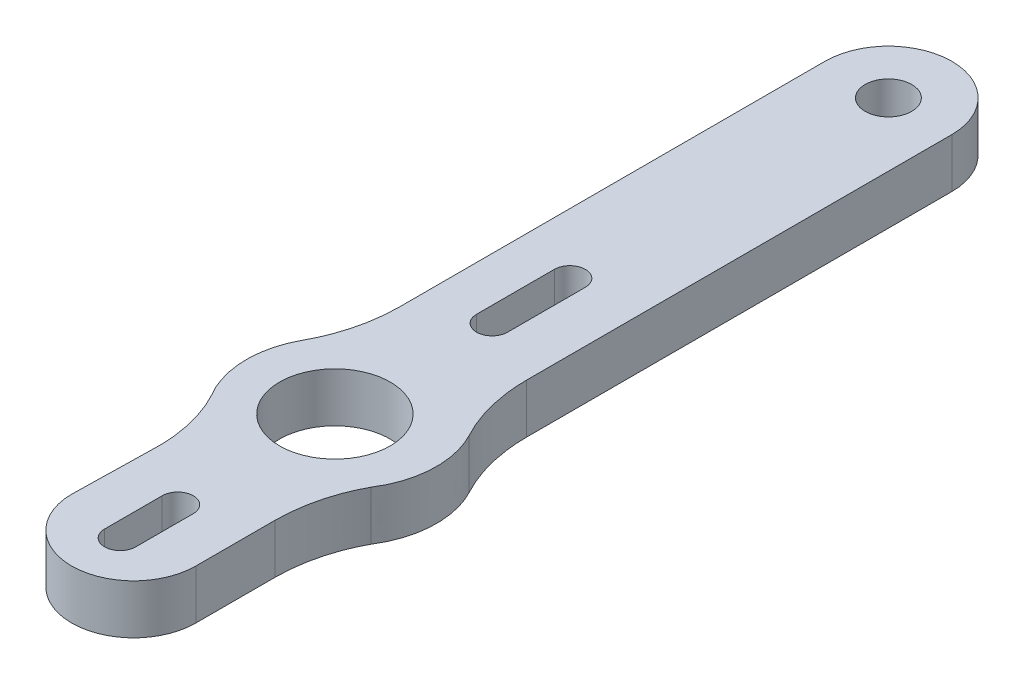
ISO-10303-21;
HEADER;
FILE_DESCRIPTION(('STEP AP214'),'2;1');
FILE_NAME('part.step','',(''),(''),'','','');
FILE_SCHEMA(('AUTOMOTIVE_DESIGN { 1 0 10303 214 1 1 1 1 }'));
ENDSEC;
DATA;
#1=APPLICATION_CONTEXT('core data for automotive mechanical design processes');
#2=APPLICATION_PROTOCOL_DEFINITION('international standard','automotive_design',2000,#1);
#3=PRODUCT_CONTEXT('',#1,'mechanical');
#4=PRODUCT('Part','Part','',(#3));
#5=PRODUCT_RELATED_PRODUCT_CATEGORY('part','',(#4));
#6=PRODUCT_DEFINITION_FORMATION('','',#4);
#7=PRODUCT_DEFINITION_CONTEXT('part definition',#1,'design');
#8=PRODUCT_DEFINITION('design','',#6,#7);
#9=PRODUCT_DEFINITION_SHAPE('','',#8);
#10=(LENGTH_UNIT() NAMED_UNIT(*) SI_UNIT(.MILLI.,.METRE.));
#11=(NAMED_UNIT(*) PLANE_ANGLE_UNIT() SI_UNIT($,.RADIAN.));
#12=(NAMED_UNIT(*) SI_UNIT($,.STERADIAN.) SOLID_ANGLE_UNIT());
#13=UNCERTAINTY_MEASURE_WITH_UNIT(LENGTH_MEASURE(1.E-05),#10,'distance_accuracy_value','');
#14=(GEOMETRIC_REPRESENTATION_CONTEXT(3) GLOBAL_UNCERTAINTY_ASSIGNED_CONTEXT((#13)) GLOBAL_UNIT_ASSIGNED_CONTEXT((#10,
#11,#12)) REPRESENTATION_CONTEXT('',''));
#15=CARTESIAN_POINT('',(0.,0.,0.));
#16=DIRECTION('',(0.,0.,1.));
#17=DIRECTION('',(1.,0.,0.));
#18=AXIS2_PLACEMENT_3D('',#15,#16,#17);
#19=CARTESIAN_POINT('',(-4.16908106055203,3.175,15.9949920017812));
#20=DIRECTION('',(0.,-1.,0.));
#21=DIRECTION('',(0.,0.,-1.));
#22=AXIS2_PLACEMENT_3D('',#19,#20,#21);
#23=PLANE('',#22);
#24=CARTESIAN_POINT('',(0.00104066737557961,3.175,10.9132962446336));
#25=DIRECTION('',(0.,1.,0.));
#26=DIRECTION('',(0.,0.,1.));
#27=AXIS2_PLACEMENT_3D('',#24,#25,#26);
#28=CIRCLE('',#27,3.556);
#29=CARTESIAN_POINT('',(0.00104066737557961,3.175,14.4692962446336));
#30=VERTEX_POINT('',#29);
#31=EDGE_CURVE('E206',#30,#30,#28,.T.);
#32=ORIENTED_EDGE('',*,*,#31,.F.);
#33=EDGE_LOOP('',(#32));
#34=FACE_BOUND('',#33,.T.);
#35=CARTESIAN_POINT('',(0.00106991381050581,3.175,0.813017652380107));
#36=DIRECTION('',(0.,1.,0.));
#37=DIRECTION('',(0.,0.,-1.));
#38=AXIS2_PLACEMENT_3D('',#35,#36,#37);
#39=CIRCLE('',#38,0.998231383477141);
#40=CARTESIAN_POINT('',(-0.997161469666635,3.175,0.813017652380107));
#41=VERTEX_POINT('',#40);
#42=CARTESIAN_POINT('',(0.999301297287647,3.175,0.813017652380107));
#43=VERTEX_POINT('',#42);
#44=EDGE_CURVE('E212',#41,#43,#39,.T.);
#45=ORIENTED_EDGE('',*,*,#44,.F.);
#46=DIRECTION('',(0.,0.,1.));
#47=VECTOR('',#46,1.);
#48=CARTESIAN_POINT('',(-0.997161469666635,3.175,-4.18720119916506));
#49=LINE('',#48,#47);
#50=CARTESIAN_POINT('',(-0.997161469666635,3.175,-4.18720119916506));
#51=VERTEX_POINT('',#50);
#52=EDGE_CURVE('E220',#51,#41,#49,.T.);
#53=ORIENTED_EDGE('',*,*,#52,.F.);
#54=CARTESIAN_POINT('',(0.00106991381050581,3.175,-4.18720119916506));
#55=DIRECTION('',(0.,1.,0.));
#56=DIRECTION('',(0.,0.,-1.));
#57=AXIS2_PLACEMENT_3D('',#54,#55,#56);
#58=CIRCLE('',#57,0.998231383477141);
#59=CARTESIAN_POINT('',(0.999301297287647,3.175,-4.18720119916506));
#60=VERTEX_POINT('',#59);
#61=EDGE_CURVE('E217',#60,#51,#58,.T.);
#62=ORIENTED_EDGE('',*,*,#61,.F.);
#63=DIRECTION('',(0.,0.,-1.));
#64=VECTOR('',#63,1.);
#65=CARTESIAN_POINT('',(0.999301297287647,3.175,0.813017652380107));
#66=LINE('',#65,#64);
#67=EDGE_CURVE('E214',#43,#60,#66,.T.);
#68=ORIENTED_EDGE('',*,*,#67,.F.);
#69=EDGE_LOOP('',(#45,#53,#62,#68));
#70=FACE_BOUND('',#69,.T.);
#71=CARTESIAN_POINT('',(-5.01632488886748,3.175,13.8183221379926));
#72=CARTESIAN_POINT('',(-4.27138671891038,3.175,15.1671684650016));
#73=CARTESIAN_POINT('',(-3.8805408597044,3.175,16.7746802356492));
#74=CARTESIAN_POINT('',(-3.8805408597044,3.175,18.3160677743046));
#75=B_SPLINE_CURVE_WITH_KNOTS('',3,(#71,#72,#73,#74),.UNSPECIFIED.,.F.,.F.,(4,4),(17.,18.),.UNSPECIFIED.);
#76=CARTESIAN_POINT('',(-5.01632488886748,3.175,13.8183221379926));
#77=VERTEX_POINT('',#76);
#78=CARTESIAN_POINT('',(-3.8805408597044,3.175,18.3160677743046));
#79=VERTEX_POINT('',#78);
#80=EDGE_CURVE('E248',#77,#79,#75,.T.);
#81=ORIENTED_EDGE('',*,*,#80,.T.);
#82=DIRECTION('',(-0.0201380543596992,0.,0.999797208821172));
#83=VECTOR('',#82,1.);
#84=CARTESIAN_POINT('',(-3.9918751177016,3.175,23.8434975052788));
#85=LINE('',#84,#83);
#86=CARTESIAN_POINT('',(-3.9918751177016,3.175,23.8434975052788));
#87=VERTEX_POINT('',#86);
#88=EDGE_CURVE('E254',#79,#87,#85,.T.);
#89=ORIENTED_EDGE('',*,*,#88,.T.);
#90=CARTESIAN_POINT('',(0.00106991313382748,3.175,23.8434975052788));
#91=DIRECTION('',(0.,1.,0.));
#92=DIRECTION('',(0.,0.,-1.));
#93=AXIS2_PLACEMENT_3D('',#90,#91,#92);
#94=CIRCLE('',#93,3.99294503083543);
#95=CARTESIAN_POINT('',(3.99401494396925,3.175,23.8434975052788));
#96=VERTEX_POINT('',#95);
#97=EDGE_CURVE('E260',#87,#96,#94,.T.);
#98=ORIENTED_EDGE('',*,*,#97,.T.);
#99=DIRECTION('',(0.,0.,-1.));
#100=VECTOR('',#99,1.);
#101=CARTESIAN_POINT('',(3.99401494396925,3.175,18.7597185620705));
#102=LINE('',#101,#100);
#103=CARTESIAN_POINT('',(3.99401494396925,3.175,18.7597185620705));
#104=VERTEX_POINT('',#103);
#105=EDGE_CURVE('E262',#96,#104,#102,.T.);
#106=ORIENTED_EDGE('',*,*,#105,.T.);
#107=CARTESIAN_POINT('',(3.99401494396925,3.175,18.7597185620705));
#108=CARTESIAN_POINT('',(3.99401494404401,3.175,17.0662909012822));
#109=CARTESIAN_POINT('',(4.42341324434701,3.175,15.3002166148642));
#110=CARTESIAN_POINT('',(5.24176274182083,3.175,13.8183221379926));
#111=B_SPLINE_CURVE_WITH_KNOTS('',3,(#107,#108,#109,#110),.UNSPECIFIED.,.F.,.F.,(4,4),(11.,12.),.UNSPECIFIED.);
#112=CARTESIAN_POINT('',(5.24176274182083,3.175,13.8183221379926));
#113=VERTEX_POINT('',#112);
#114=EDGE_CURVE('E264',#104,#113,#111,.T.);
#115=ORIENTED_EDGE('',*,*,#114,.T.);
#116=CARTESIAN_POINT('',(5.24176274182083,3.175,13.8183221379926));
#117=CARTESIAN_POINT('',(6.37392492293468,3.175,12.0533043274419));
#118=CARTESIAN_POINT('',(6.5298845256268,3.175,9.76643510192553));
#119=CARTESIAN_POINT('',(5.52292472318315,3.175,7.81618794224595));
#120=B_SPLINE_CURVE_WITH_KNOTS('',3,(#116,#117,#118,#119),.UNSPECIFIED.,.F.,.F.,(4,4),(9.,10.),.UNSPECIFIED.);
#121=CARTESIAN_POINT('',(5.52292472318315,3.175,7.81618794224595));
#122=VERTEX_POINT('',#121);
#123=EDGE_CURVE('E269',#113,#122,#120,.T.);
#124=ORIENTED_EDGE('',*,*,#123,.T.);
#125=CARTESIAN_POINT('',(5.52292472318315,3.175,7.81618794224595));
#126=CARTESIAN_POINT('',(4.70457522584158,3.175,6.33422998434839));
#127=CARTESIAN_POINT('',(4.27517692569758,3.175,4.56821917884142));
#128=CARTESIAN_POINT('',(4.27517692577307,3.175,2.8747280371003));
#129=B_SPLINE_CURVE_WITH_KNOTS('',3,(#125,#126,#127,#128),.UNSPECIFIED.,.F.,.F.,(4,4),(8.,9.),.UNSPECIFIED.);
#130=CARTESIAN_POINT('',(4.27517692577307,3.175,2.8747280371003));
#131=VERTEX_POINT('',#130);
#132=EDGE_CURVE('E468',#122,#131,#129,.T.);
#133=ORIENTED_EDGE('',*,*,#132,.T.);
#134=DIRECTION('',(0.,0.,-1.));
#135=VECTOR('',#134,1.);
#136=CARTESIAN_POINT('',(4.27517692577307,3.175,-24.4794195778738));
#137=LINE('',#136,#135);
#138=CARTESIAN_POINT('',(4.27517692577307,3.175,-24.4794195778738));
#139=VERTEX_POINT('',#138);
#140=EDGE_CURVE('E463',#131,#139,#137,.T.);
#141=ORIENTED_EDGE('',*,*,#140,.T.);
#142=CARTESIAN_POINT('',(0.197318033034327,3.175,-24.4630373756859));
#143=DIRECTION('',(0.,1.,0.));
#144=DIRECTION('',(0.,0.,1.));
#145=AXIS2_PLACEMENT_3D('',#142,#143,#144);
#146=CIRCLE('',#145,4.07789179915761);
#147=CARTESIAN_POINT('',(-3.88054085970441,3.175,-24.4466551734979));
#148=VERTEX_POINT('',#147);
#149=EDGE_CURVE('E459',#139,#148,#146,.T.);
#150=ORIENTED_EDGE('',*,*,#149,.T.);
#151=DIRECTION('',(0.,0.,1.));
#152=VECTOR('',#151,1.);
#153=CARTESIAN_POINT('',(-3.88054085970441,3.175,-24.4466551734979));
#154=LINE('',#153,#152);
#155=CARTESIAN_POINT('',(-3.88054085970441,3.175,2.87423818270168));
#156=VERTEX_POINT('',#155);
#157=EDGE_CURVE('E450',#148,#156,#154,.T.);
#158=ORIENTED_EDGE('',*,*,#157,.T.);
#159=CARTESIAN_POINT('',(-3.88054085970441,3.175,2.87423818270168));
#160=CARTESIAN_POINT('',(-3.87987552925061,3.175,4.56772919374628));
#161=CARTESIAN_POINT('',(-4.30857997471308,3.175,6.33390856282873));
#162=CARTESIAN_POINT('',(-5.12641542509204,3.175,7.81618794224595));
#163=B_SPLINE_CURVE_WITH_KNOTS('',3,(#159,#160,#161,#162),.UNSPECIFIED.,.F.,.F.,(4,4),(2.,3.),.UNSPECIFIED.);
#164=CARTESIAN_POINT('',(-5.12641542509204,3.175,7.81618794224595));
#165=VERTEX_POINT('',#164);
#166=EDGE_CURVE('E328',#156,#165,#163,.T.);
#167=ORIENTED_EDGE('',*,*,#166,.T.);
#168=CARTESIAN_POINT('',(-5.12641542509204,3.175,7.81618794224595));
#169=CARTESIAN_POINT('',(-6.18649366447637,3.175,9.73551085026569));
#170=CARTESIAN_POINT('',(-6.09564359098047,3.175,12.0230732710247));
#171=CARTESIAN_POINT('',(-5.01632488886748,3.175,13.8183221379926));
#172=B_SPLINE_CURVE_WITH_KNOTS('',3,(#168,#169,#170,#171),.UNSPECIFIED.,.F.,.F.,(4,4),
(1.00565880697643,2.),.UNSPECIFIED.);
#173=EDGE_CURVE('E322',#165,#77,#172,.T.);
#174=ORIENTED_EDGE('',*,*,#173,.T.);
#175=EDGE_LOOP('',(#81,#89,#98,#106,#115,#124,#133,#141,#150,#158,#167,#174));
#176=FACE_BOUND('',#175,.T.);
#177=CARTESIAN_POINT('',(0.197318033034327,3.175,-24.4630373756859));
#178=DIRECTION('',(0.,1.,0.));
#179=DIRECTION('',(0.,0.,1.));
#180=AXIS2_PLACEMENT_3D('',#177,#178,#179);
#181=CIRCLE('',#180,1.4986);
#182=CARTESIAN_POINT('',(0.197318033034327,3.175,-22.9644373756859));
#183=VERTEX_POINT('',#182);
#184=EDGE_CURVE('E243',#183,#183,#181,.T.);
#185=ORIENTED_EDGE('',*,*,#184,.F.);
#186=EDGE_LOOP('',(#185));
#187=FACE_BOUND('',#186,.T.);
#188=CARTESIAN_POINT('',(0.00106991253301218,3.175,24.7136744780451));
#189=DIRECTION('',(0.,1.,0.));
#190=DIRECTION('',(0.,0.,1.));
#191=AXIS2_PLACEMENT_3D('',#188,#189,#190);
#192=CIRCLE('',#191,0.998231383459032);
#193=CARTESIAN_POINT('',(-0.99716147092602,3.175,24.7136744780451));
#194=VERTEX_POINT('',#193);
#195=CARTESIAN_POINT('',(0.999301295992044,3.175,24.7136744780451));
#196=VERTEX_POINT('',#195);
#197=EDGE_CURVE('E170',#194,#196,#192,.T.);
#198=ORIENTED_EDGE('',*,*,#197,.F.);
#199=DIRECTION('',(0.,0.,1.));
#200=VECTOR('',#199,1.);
#201=CARTESIAN_POINT('',(-0.99716147092602,3.175,24.7136744780451));
#202=LINE('',#201,#200);
#203=CARTESIAN_POINT('',(-0.99716147092602,3.175,21.013579720048));
#204=VERTEX_POINT('',#203);
#205=EDGE_CURVE('E192',#204,#194,#202,.T.);
#206=ORIENTED_EDGE('',*,*,#205,.F.);
#207=CARTESIAN_POINT('',(0.00106991253301207,3.175,21.013579720048));
#208=DIRECTION('',(0.,1.,0.));
#209=DIRECTION('',(0.,0.,-1.));
#210=AXIS2_PLACEMENT_3D('',#207,#208,#209);
#211=CIRCLE('',#210,0.998231383459032);
#212=CARTESIAN_POINT('',(0.999301295992044,3.175,21.013579720048));
#213=VERTEX_POINT('',#212);
#214=EDGE_CURVE('E190',#213,#204,#211,.T.);
#215=ORIENTED_EDGE('',*,*,#214,.F.);
#216=DIRECTION('',(0.,0.,-1.));
#217=VECTOR('',#216,1.);
#218=CARTESIAN_POINT('',(0.999301295992044,3.175,24.7136744780451));
#219=LINE('',#218,#217);
#220=EDGE_CURVE('E178',#196,#213,#219,.T.);
#221=ORIENTED_EDGE('',*,*,#220,.F.);
#222=EDGE_LOOP('',(#198,#206,#215,#221));
#223=FACE_BOUND('',#222,.T.);
#224=ADVANCED_FACE('F32',(#34,#70,#176,#187,#223),#23,.F.);
#225=CARTESIAN_POINT('',(-4.16908106055203,0.,15.9949920017812));
#226=DIRECTION('',(0.,-1.,0.));
#227=DIRECTION('',(0.,0.,-1.));
#228=AXIS2_PLACEMENT_3D('',#225,#226,#227);
#229=PLANE('',#228);
#230=DIRECTION('',(0.,0.,1.));
#231=VECTOR('',#230,1.);
#232=CARTESIAN_POINT('',(-0.997161469666635,0.,-4.18720119916506));
#233=LINE('',#232,#231);
#234=CARTESIAN_POINT('',(-0.997161469666635,0.,-4.18720119916506));
#235=VERTEX_POINT('',#234);
#236=CARTESIAN_POINT('',(-0.997161469666635,0.,0.813017652380107));
#237=VERTEX_POINT('',#236);
#238=EDGE_CURVE('E215',#235,#237,#233,.T.);
#239=ORIENTED_EDGE('',*,*,#238,.T.);
#240=CARTESIAN_POINT('',(0.00106991381050581,0.,0.813017652380107));
#241=DIRECTION('',(0.,1.,0.));
#242=DIRECTION('',(0.,0.,-1.));
#243=AXIS2_PLACEMENT_3D('',#240,#241,#242);
#244=CIRCLE('',#243,0.998231383477141);
#245=CARTESIAN_POINT('',(0.999301297287647,0.,0.813017652380107));
#246=VERTEX_POINT('',#245);
#247=EDGE_CURVE('E209',#237,#246,#244,.T.);
#248=ORIENTED_EDGE('',*,*,#247,.T.);
#249=DIRECTION('',(0.,0.,-1.));
#250=VECTOR('',#249,1.);
#251=CARTESIAN_POINT('',(0.999301297287647,0.,0.813017652380107));
#252=LINE('',#251,#250);
#253=CARTESIAN_POINT('',(0.999301297287647,0.,-4.18720119916506));
#254=VERTEX_POINT('',#253);
#255=EDGE_CURVE('E225',#246,#254,#252,.T.);
#256=ORIENTED_EDGE('',*,*,#255,.T.);
#257=CARTESIAN_POINT('',(0.00106991381050581,0.,-4.18720119916506));
#258=DIRECTION('',(0.,1.,0.));
#259=DIRECTION('',(0.,0.,-1.));
#260=AXIS2_PLACEMENT_3D('',#257,#258,#259);
#261=CIRCLE('',#260,0.998231383477141);
#262=EDGE_CURVE('E228',#254,#235,#261,.T.);
#263=ORIENTED_EDGE('',*,*,#262,.T.);
#264=EDGE_LOOP('',(#239,#248,#256,#263));
#265=FACE_BOUND('',#264,.T.);
#266=CARTESIAN_POINT('',(0.197318033034327,0.,-24.4630373756859));
#267=DIRECTION('',(0.,1.,0.));
#268=DIRECTION('',(0.,0.,1.));
#269=AXIS2_PLACEMENT_3D('',#266,#267,#268);
#270=CIRCLE('',#269,1.4986);
#271=CARTESIAN_POINT('',(0.197318033034327,0.,-22.9644373756859));
#272=VERTEX_POINT('',#271);
#273=EDGE_CURVE('E242',#272,#272,#270,.T.);
#274=ORIENTED_EDGE('',*,*,#273,.T.);
#275=EDGE_LOOP('',(#274));
#276=FACE_BOUND('',#275,.T.);
#277=CARTESIAN_POINT('',(-5.01632488886748,0.,13.8183221379926));
#278=CARTESIAN_POINT('',(-4.27138671891038,0.,15.1671684650016));
#279=CARTESIAN_POINT('',(-3.8805408597044,0.,16.7746802356492));
#280=CARTESIAN_POINT('',(-3.8805408597044,0.,18.3160677743046));
#281=B_SPLINE_CURVE_WITH_KNOTS('',3,(#277,#278,#279,#280),.UNSPECIFIED.,.F.,.F.,(4,4),(17.,18.),.UNSPECIFIED.);
#282=CARTESIAN_POINT('',(-5.01632488886748,0.,13.8183221379926));
#283=VERTEX_POINT('',#282);
#284=CARTESIAN_POINT('',(-3.8805408597044,0.,18.3160677743046));
#285=VERTEX_POINT('',#284);
#286=EDGE_CURVE('E246',#283,#285,#281,.T.);
#287=ORIENTED_EDGE('',*,*,#286,.F.);
#288=CARTESIAN_POINT('',(-5.12641542509204,0.,7.81618794224595));
#289=CARTESIAN_POINT('',(-6.18649366447637,0.,9.73551085026569));
#290=CARTESIAN_POINT('',(-6.09564359098047,0.,12.0230732710247));
#291=CARTESIAN_POINT('',(-5.01632488886748,0.,13.8183221379926));
#292=B_SPLINE_CURVE_WITH_KNOTS('',3,(#288,#289,#290,#291),.UNSPECIFIED.,.F.,.F.,(4,4),
(1.00565880697643,2.),.UNSPECIFIED.);
#293=CARTESIAN_POINT('',(-5.12641542509204,0.,7.81618794224595));
#294=VERTEX_POINT('',#293);
#295=EDGE_CURVE('E255',#294,#283,#292,.T.);
#296=ORIENTED_EDGE('',*,*,#295,.F.);
#297=CARTESIAN_POINT('',(-3.88054085970441,0.,2.87423818270168));
#298=CARTESIAN_POINT('',(-3.87987552925061,0.,4.56772919374628));
#299=CARTESIAN_POINT('',(-4.30857997471308,0.,6.33390856282873));
#300=CARTESIAN_POINT('',(-5.12641542509204,0.,7.81618794224595));
#301=B_SPLINE_CURVE_WITH_KNOTS('',3,(#297,#298,#299,#300),.UNSPECIFIED.,.F.,.F.,(4,4),(2.,3.),.UNSPECIFIED.);
#302=CARTESIAN_POINT('',(-3.88054085970441,0.,2.87423818270168));
#303=VERTEX_POINT('',#302);
#304=EDGE_CURVE('E376',#303,#294,#301,.T.);
#305=ORIENTED_EDGE('',*,*,#304,.F.);
#306=DIRECTION('',(0.,0.,1.));
#307=VECTOR('',#306,1.);
#308=CARTESIAN_POINT('',(-3.88054085970441,0.,-24.4466551734979));
#309=LINE('',#308,#307);
#310=CARTESIAN_POINT('',(-3.88054085970441,0.,-24.4466551734979));
#311=VERTEX_POINT('',#310);
#312=EDGE_CURVE('E374',#311,#303,#309,.T.);
#313=ORIENTED_EDGE('',*,*,#312,.F.);
#314=CARTESIAN_POINT('',(0.197318033034327,0.,-24.4630373756859));
#315=DIRECTION('',(0.,1.,0.));
#316=DIRECTION('',(0.,0.,1.));
#317=AXIS2_PLACEMENT_3D('',#314,#315,#316);
#318=CIRCLE('',#317,4.07789179915761);
#319=CARTESIAN_POINT('',(4.27517692577307,0.,-24.4794195778738));
#320=VERTEX_POINT('',#319);
#321=EDGE_CURVE('E372',#320,#311,#318,.T.);
#322=ORIENTED_EDGE('',*,*,#321,.F.);
#323=DIRECTION('',(0.,0.,-1.));
#324=VECTOR('',#323,1.);
#325=CARTESIAN_POINT('',(4.27517692577307,0.,-24.4794195778738));
#326=LINE('',#325,#324);
#327=CARTESIAN_POINT('',(4.27517692577307,0.,2.8747280371003));
#328=VERTEX_POINT('',#327);
#329=EDGE_CURVE('E367',#328,#320,#326,.T.);
#330=ORIENTED_EDGE('',*,*,#329,.F.);
#331=CARTESIAN_POINT('',(5.52292472318315,0.,7.81618794224595));
#332=CARTESIAN_POINT('',(4.70457522584158,0.,6.33422998434839));
#333=CARTESIAN_POINT('',(4.27517692569758,0.,4.56821917884142));
#334=CARTESIAN_POINT('',(4.27517692577307,0.,2.8747280371003));
#335=B_SPLINE_CURVE_WITH_KNOTS('',3,(#331,#332,#333,#334),.UNSPECIFIED.,.F.,.F.,(4,4),(8.,9.),.UNSPECIFIED.);
#336=CARTESIAN_POINT('',(5.52292472318315,0.,7.81618794224595));
#337=VERTEX_POINT('',#336);
#338=EDGE_CURVE('E360',#337,#328,#335,.T.);
#339=ORIENTED_EDGE('',*,*,#338,.F.);
#340=CARTESIAN_POINT('',(5.24176274182083,0.,13.8183221379926));
#341=CARTESIAN_POINT('',(6.37392492293468,0.,12.0533043274419));
#342=CARTESIAN_POINT('',(6.5298845256268,0.,9.76643510192553));
#343=CARTESIAN_POINT('',(5.52292472318315,0.,7.81618794224595));
#344=B_SPLINE_CURVE_WITH_KNOTS('',3,(#340,#341,#342,#343),.UNSPECIFIED.,.F.,.F.,(4,4),(9.,10.),.UNSPECIFIED.);
#345=CARTESIAN_POINT('',(5.24176274182083,0.,13.8183221379926));
#346=VERTEX_POINT('',#345);
#347=EDGE_CURVE('E353',#346,#337,#344,.T.);
#348=ORIENTED_EDGE('',*,*,#347,.F.);
#349=CARTESIAN_POINT('',(3.99401494396925,0.,18.7597185620705));
#350=CARTESIAN_POINT('',(3.99401494404401,0.,17.0662909012822));
#351=CARTESIAN_POINT('',(4.42341324434701,0.,15.3002166148642));
#352=CARTESIAN_POINT('',(5.24176274182083,0.,13.8183221379926));
#353=B_SPLINE_CURVE_WITH_KNOTS('',3,(#349,#350,#351,#352),.UNSPECIFIED.,.F.,.F.,(4,4),(11.,12.),.UNSPECIFIED.);
#354=CARTESIAN_POINT('',(3.99401494396925,0.,18.7597185620705));
#355=VERTEX_POINT('',#354);
#356=EDGE_CURVE('E349',#355,#346,#353,.T.);
#357=ORIENTED_EDGE('',*,*,#356,.F.);
#358=DIRECTION('',(0.,0.,-1.));
#359=VECTOR('',#358,1.);
#360=CARTESIAN_POINT('',(3.99401494396925,0.,18.7597185620705));
#361=LINE('',#360,#359);
#362=CARTESIAN_POINT('',(3.99401494396925,0.,23.8434975052788));
#363=VERTEX_POINT('',#362);
#364=EDGE_CURVE('E347',#363,#355,#361,.T.);
#365=ORIENTED_EDGE('',*,*,#364,.F.);
#366=CARTESIAN_POINT('',(0.00106991313382748,0.,23.8434975052788));
#367=DIRECTION('',(0.,1.,0.));
#368=DIRECTION('',(0.,0.,-1.));
#369=AXIS2_PLACEMENT_3D('',#366,#367,#368);
#370=CIRCLE('',#369,3.99294503083543);
#371=CARTESIAN_POINT('',(-3.9918751177016,0.,23.8434975052788));
#372=VERTEX_POINT('',#371);
#373=EDGE_CURVE('E345',#372,#363,#370,.T.);
#374=ORIENTED_EDGE('',*,*,#373,.F.);
#375=DIRECTION('',(-0.0201380543596992,0.,0.999797208821172));
#376=VECTOR('',#375,1.);
#377=CARTESIAN_POINT('',(-3.9918751177016,0.,23.8434975052788));
#378=LINE('',#377,#376);
#379=EDGE_CURVE('E340',#285,#372,#378,.T.);
#380=ORIENTED_EDGE('',*,*,#379,.F.);
#381=EDGE_LOOP('',(#287,#296,#305,#313,#322,#330,#339,#348,#357,#365,#374,#380));
#382=FACE_BOUND('',#381,.T.);
#383=CARTESIAN_POINT('',(0.00104066737557961,0.,10.9132962446336));
#384=DIRECTION('',(0.,1.,0.));
#385=DIRECTION('',(0.,0.,1.));
#386=AXIS2_PLACEMENT_3D('',#383,#384,#385);
#387=CIRCLE('',#386,3.556);
#388=CARTESIAN_POINT('',(0.00104066737557961,0.,14.4692962446336));
#389=VERTEX_POINT('',#388);
#390=EDGE_CURVE('E186',#389,#389,#387,.T.);
#391=ORIENTED_EDGE('',*,*,#390,.T.);
#392=EDGE_LOOP('',(#391));
#393=FACE_BOUND('',#392,.T.);
#394=DIRECTION('',(0.,0.,1.));
#395=VECTOR('',#394,1.);
#396=CARTESIAN_POINT('',(-0.99716147092602,0.,24.7136744780451));
#397=LINE('',#396,#395);
#398=CARTESIAN_POINT('',(-0.99716147092602,0.,21.013579720048));
#399=VERTEX_POINT('',#398);
#400=CARTESIAN_POINT('',(-0.99716147092602,0.,24.7136744780451));
#401=VERTEX_POINT('',#400);
#402=EDGE_CURVE('E179',#399,#401,#397,.T.);
#403=ORIENTED_EDGE('',*,*,#402,.T.);
#404=CARTESIAN_POINT('',(0.00106991253301218,0.,24.7136744780451));
#405=DIRECTION('',(0.,1.,0.));
#406=DIRECTION('',(0.,0.,1.));
#407=AXIS2_PLACEMENT_3D('',#404,#405,#406);
#408=CIRCLE('',#407,0.998231383459032);
#409=CARTESIAN_POINT('',(0.999301295992044,0.,24.7136744780451));
#410=VERTEX_POINT('',#409);
#411=EDGE_CURVE('E56',#401,#410,#408,.T.);
#412=ORIENTED_EDGE('',*,*,#411,.T.);
#413=DIRECTION('',(0.,0.,-1.));
#414=VECTOR('',#413,1.);
#415=CARTESIAN_POINT('',(0.999301295992044,0.,24.7136744780451));
#416=LINE('',#415,#414);
#417=CARTESIAN_POINT('',(0.999301295992044,0.,21.013579720048));
#418=VERTEX_POINT('',#417);
#419=EDGE_CURVE('E185',#410,#418,#416,.T.);
#420=ORIENTED_EDGE('',*,*,#419,.T.);
#421=CARTESIAN_POINT('',(0.00106991253301207,0.,21.013579720048));
#422=DIRECTION('',(0.,1.,0.));
#423=DIRECTION('',(0.,0.,-1.));
#424=AXIS2_PLACEMENT_3D('',#421,#422,#423);
#425=CIRCLE('',#424,0.998231383459032);
#426=EDGE_CURVE('E198',#418,#399,#425,.T.);
#427=ORIENTED_EDGE('',*,*,#426,.T.);
#428=EDGE_LOOP('',(#403,#412,#420,#427));
#429=FACE_BOUND('',#428,.T.);
#430=ADVANCED_FACE('F298',(#265,#276,#382,#393,#429),#229,.T.);
#431=DIRECTION('',(0.,-1.,0.));
#432=VECTOR('',#431,1.);
#433=SURFACE_OF_LINEAR_EXTRUSION('',#75,#432);
#434=ORIENTED_EDGE('',*,*,#286,.T.);
#435=DIRECTION('',(0.,-1.,0.));
#436=VECTOR('',#435,1.);
#437=CARTESIAN_POINT('',(-3.8805408597044,3.175,18.3160677743046));
#438=LINE('',#437,#436);
#439=EDGE_CURVE('E11',#79,#285,#438,.T.);
#440=ORIENTED_EDGE('',*,*,#439,.F.);
#441=ORIENTED_EDGE('',*,*,#80,.F.);
#442=DIRECTION('',(0.,-1.,0.));
#443=VECTOR('',#442,1.);
#444=CARTESIAN_POINT('',(-5.01632488886748,3.175,13.8183221379926));
#445=LINE('',#444,#443);
#446=EDGE_CURVE('E327',#77,#283,#445,.T.);
#447=ORIENTED_EDGE('',*,*,#446,.T.);
#448=EDGE_LOOP('',(#434,#440,#441,#447));
#449=FACE_BOUND('',#448,.T.);
#450=ADVANCED_FACE('F34',(#449),#433,.F.);
#451=CARTESIAN_POINT('',(-3.9918751177016,3.175,23.8434975052788));
#452=DIRECTION('',(0.999797208821172,0.,0.0201380543596992));
#453=DIRECTION('',(0.0201380543596992,0.,-0.999797208821172));
#454=AXIS2_PLACEMENT_3D('',#451,#452,#453);
#455=PLANE('',#454);
#456=ORIENTED_EDGE('',*,*,#379,.T.);
#457=DIRECTION('',(0.,-1.,0.));
#458=VECTOR('',#457,1.);
#459=CARTESIAN_POINT('',(-3.9918751177016,3.175,23.8434975052788));
#460=LINE('',#459,#458);
#461=EDGE_CURVE('E41',#87,#372,#460,.T.);
#462=ORIENTED_EDGE('',*,*,#461,.F.);
#463=ORIENTED_EDGE('',*,*,#88,.F.);
#464=ORIENTED_EDGE('',*,*,#439,.T.);
#465=EDGE_LOOP('',(#456,#462,#463,#464));
#466=FACE_BOUND('',#465,.T.);
#467=ADVANCED_FACE('F291',(#466),#455,.F.);
#468=CARTESIAN_POINT('',(0.00106991313382748,3.175,23.8434975052788));
#469=DIRECTION('',(0.,-1.,0.));
#470=DIRECTION('',(0.,0.,-1.));
#471=AXIS2_PLACEMENT_3D('',#468,#469,#470);
#472=CYLINDRICAL_SURFACE('',#471,3.99294503083543);
#473=ORIENTED_EDGE('',*,*,#373,.T.);
#474=DIRECTION('',(0.,-1.,0.));
#475=VECTOR('',#474,1.);
#476=CARTESIAN_POINT('',(3.99401494396925,3.175,23.8434975052788));
#477=LINE('',#476,#475);
#478=EDGE_CURVE('E415',#96,#363,#477,.T.);
#479=ORIENTED_EDGE('',*,*,#478,.F.);
#480=ORIENTED_EDGE('',*,*,#97,.F.);
#481=ORIENTED_EDGE('',*,*,#461,.T.);
#482=EDGE_LOOP('',(#473,#479,#480,#481));
#483=FACE_BOUND('',#482,.T.);
#484=ADVANCED_FACE('F288',(#483),#472,.T.);
#485=CARTESIAN_POINT('',(3.99401494396925,3.175,18.7597185620705));
#486=DIRECTION('',(-1.,0.,0.));
#487=DIRECTION('',(0.,0.,1.));
#488=AXIS2_PLACEMENT_3D('',#485,#486,#487);
#489=PLANE('',#488);
#490=ORIENTED_EDGE('',*,*,#364,.T.);
#491=DIRECTION('',(0.,-1.,0.));
#492=VECTOR('',#491,1.);
#493=CARTESIAN_POINT('',(3.99401494396925,3.175,18.7597185620705));
#494=LINE('',#493,#492);
#495=EDGE_CURVE('E412',#104,#355,#494,.T.);
#496=ORIENTED_EDGE('',*,*,#495,.F.);
#497=ORIENTED_EDGE('',*,*,#105,.F.);
#498=ORIENTED_EDGE('',*,*,#478,.T.);
#499=EDGE_LOOP('',(#490,#496,#497,#498));
#500=FACE_BOUND('',#499,.T.);
#501=ADVANCED_FACE('F283',(#500),#489,.F.);
#502=DIRECTION('',(0.,-1.,0.));
#503=VECTOR('',#502,1.);
#504=SURFACE_OF_LINEAR_EXTRUSION('',#111,#503);
#505=ORIENTED_EDGE('',*,*,#356,.T.);
#506=DIRECTION('',(0.,-1.,0.));
#507=VECTOR('',#506,1.);
#508=CARTESIAN_POINT('',(5.24176274182083,3.175,13.8183221379926));
#509=LINE('',#508,#507);
#510=EDGE_CURVE('E409',#113,#346,#509,.T.);
#511=ORIENTED_EDGE('',*,*,#510,.F.);
#512=ORIENTED_EDGE('',*,*,#114,.F.);
#513=ORIENTED_EDGE('',*,*,#495,.T.);
#514=EDGE_LOOP('',(#505,#511,#512,#513));
#515=FACE_BOUND('',#514,.T.);
#516=ADVANCED_FACE('F278',(#515),#504,.F.);
#517=DIRECTION('',(0.,-1.,0.));
#518=VECTOR('',#517,1.);
#519=SURFACE_OF_LINEAR_EXTRUSION('',#120,#518);
#520=ORIENTED_EDGE('',*,*,#347,.T.);
#521=DIRECTION('',(0.,-1.,0.));
#522=VECTOR('',#521,1.);
#523=CARTESIAN_POINT('',(5.52292472318315,3.175,7.81618794224595));
#524=LINE('',#523,#522);
#525=EDGE_CURVE('E406',#122,#337,#524,.T.);
#526=ORIENTED_EDGE('',*,*,#525,.F.);
#527=ORIENTED_EDGE('',*,*,#123,.F.);
#528=ORIENTED_EDGE('',*,*,#510,.T.);
#529=EDGE_LOOP('',(#520,#526,#527,#528));
#530=FACE_BOUND('',#529,.T.);
#531=ADVANCED_FACE('F282',(#530),#519,.F.);
#532=DIRECTION('',(0.,-1.,0.));
#533=VECTOR('',#532,1.);
#534=SURFACE_OF_LINEAR_EXTRUSION('',#129,#533);
#535=ORIENTED_EDGE('',*,*,#338,.T.);
#536=DIRECTION('',(0.,-1.,0.));
#537=VECTOR('',#536,1.);
#538=CARTESIAN_POINT('',(4.27517692577307,3.175,2.8747280371003));
#539=LINE('',#538,#537);
#540=EDGE_CURVE('E403',#131,#328,#539,.T.);
#541=ORIENTED_EDGE('',*,*,#540,.F.);
#542=ORIENTED_EDGE('',*,*,#132,.F.);
#543=ORIENTED_EDGE('',*,*,#525,.T.);
#544=EDGE_LOOP('',(#535,#541,#542,#543));
#545=FACE_BOUND('',#544,.T.);
#546=ADVANCED_FACE('F467',(#545),#534,.F.);
#547=CARTESIAN_POINT('',(4.27517692577307,3.175,-24.4794195778738));
#548=DIRECTION('',(-1.,0.,0.));
#549=DIRECTION('',(0.,0.,1.));
#550=AXIS2_PLACEMENT_3D('',#547,#548,#549);
#551=PLANE('',#550);
#552=ORIENTED_EDGE('',*,*,#329,.T.);
#553=DIRECTION('',(0.,-1.,0.));
#554=VECTOR('',#553,1.);
#555=CARTESIAN_POINT('',(4.27517692577307,3.175,-24.4794195778738));
#556=LINE('',#555,#554);
#557=EDGE_CURVE('E400',#139,#320,#556,.T.);
#558=ORIENTED_EDGE('',*,*,#557,.F.);
#559=ORIENTED_EDGE('',*,*,#140,.F.);
#560=ORIENTED_EDGE('',*,*,#540,.T.);
#561=EDGE_LOOP('',(#552,#558,#559,#560));
#562=FACE_BOUND('',#561,.T.);
#563=ADVANCED_FACE('F462',(#562),#551,.F.);
#564=CARTESIAN_POINT('',(0.197318033034327,3.175,-24.4630373756859));
#565=DIRECTION('',(0.,-1.,0.));
#566=DIRECTION('',(0.,0.,-1.));
#567=AXIS2_PLACEMENT_3D('',#564,#565,#566);
#568=CYLINDRICAL_SURFACE('',#567,4.07789179915761);
#569=ORIENTED_EDGE('',*,*,#321,.T.);
#570=DIRECTION('',(0.,-1.,0.));
#571=VECTOR('',#570,1.);
#572=CARTESIAN_POINT('',(-3.88054085970441,3.175,-24.4466551734979));
#573=LINE('',#572,#571);
#574=EDGE_CURVE('E397',#148,#311,#573,.T.);
#575=ORIENTED_EDGE('',*,*,#574,.F.);
#576=ORIENTED_EDGE('',*,*,#149,.F.);
#577=ORIENTED_EDGE('',*,*,#557,.T.);
#578=EDGE_LOOP('',(#569,#575,#576,#577));
#579=FACE_BOUND('',#578,.T.);
#580=ADVANCED_FACE('F456',(#579),#568,.T.);
#581=CARTESIAN_POINT('',(-3.88054085970441,3.175,-24.4466551734979));
#582=DIRECTION('',(1.,0.,0.));
#583=DIRECTION('',(0.,0.,-1.));
#584=AXIS2_PLACEMENT_3D('',#581,#582,#583);
#585=PLANE('',#584);
#586=ORIENTED_EDGE('',*,*,#312,.T.);
#587=DIRECTION('',(0.,-1.,0.));
#588=VECTOR('',#587,1.);
#589=CARTESIAN_POINT('',(-3.88054085970441,3.175,2.87423818270168));
#590=LINE('',#589,#588);
#591=EDGE_CURVE('E394',#156,#303,#590,.T.);
#592=ORIENTED_EDGE('',*,*,#591,.F.);
#593=ORIENTED_EDGE('',*,*,#157,.F.);
#594=ORIENTED_EDGE('',*,*,#574,.T.);
#595=EDGE_LOOP('',(#586,#592,#593,#594));
#596=FACE_BOUND('',#595,.T.);
#597=ADVANCED_FACE('F449',(#596),#585,.F.);
#598=DIRECTION('',(0.,-1.,0.));
#599=VECTOR('',#598,1.);
#600=SURFACE_OF_LINEAR_EXTRUSION('',#163,#599);
#601=ORIENTED_EDGE('',*,*,#304,.T.);
#602=DIRECTION('',(0.,-1.,0.));
#603=VECTOR('',#602,1.);
#604=CARTESIAN_POINT('',(-5.12641542509204,3.175,7.81618794224595));
#605=LINE('',#604,#603);
#606=EDGE_CURVE('E391',#165,#294,#605,.T.);
#607=ORIENTED_EDGE('',*,*,#606,.F.);
#608=ORIENTED_EDGE('',*,*,#166,.F.);
#609=ORIENTED_EDGE('',*,*,#591,.T.);
#610=EDGE_LOOP('',(#601,#607,#608,#609));
#611=FACE_BOUND('',#610,.T.);
#612=ADVANCED_FACE('F318',(#611),#600,.F.);
#613=DIRECTION('',(0.,-1.,0.));
#614=VECTOR('',#613,1.);
#615=SURFACE_OF_LINEAR_EXTRUSION('',#172,#614);
#616=ORIENTED_EDGE('',*,*,#295,.T.);
#617=ORIENTED_EDGE('',*,*,#446,.F.);
#618=ORIENTED_EDGE('',*,*,#173,.F.);
#619=ORIENTED_EDGE('',*,*,#606,.T.);
#620=EDGE_LOOP('',(#616,#617,#618,#619));
#621=FACE_BOUND('',#620,.T.);
#622=ADVANCED_FACE('F314',(#621),#615,.F.);
#623=CARTESIAN_POINT('',(0.197318033034327,3.175,-24.4630373756859));
#624=DIRECTION('',(0.,-1.,0.));
#625=DIRECTION('',(0.,0.,-1.));
#626=AXIS2_PLACEMENT_3D('',#623,#624,#625);
#627=CYLINDRICAL_SURFACE('',#626,1.4986);
#628=ORIENTED_EDGE('',*,*,#184,.T.);
#629=EDGE_LOOP('',(#628));
#630=FACE_BOUND('',#629,.T.);
#631=ORIENTED_EDGE('',*,*,#273,.F.);
#632=EDGE_LOOP('',(#631));
#633=FACE_BOUND('',#632,.T.);
#634=ADVANCED_FACE('F311',(#630,#633),#627,.F.);
#635=CARTESIAN_POINT('',(0.00106991381050581,3.175,0.813017652380107));
#636=DIRECTION('',(0.,-1.,0.));
#637=DIRECTION('',(0.,0.,-1.));
#638=AXIS2_PLACEMENT_3D('',#635,#636,#637);
#639=CYLINDRICAL_SURFACE('',#638,0.998231383477141);
#640=ORIENTED_EDGE('',*,*,#247,.F.);
#641=DIRECTION('',(0.,-1.,0.));
#642=VECTOR('',#641,1.);
#643=CARTESIAN_POINT('',(-0.997161469666635,3.175,0.813017652380107));
#644=LINE('',#643,#642);
#645=EDGE_CURVE('E222',#41,#237,#644,.T.);
#646=ORIENTED_EDGE('',*,*,#645,.F.);
#647=ORIENTED_EDGE('',*,*,#44,.T.);
#648=DIRECTION('',(0.,-1.,0.));
#649=VECTOR('',#648,1.);
#650=CARTESIAN_POINT('',(0.999301297287647,3.175,0.813017652380107));
#651=LINE('',#650,#649);
#652=EDGE_CURVE('E239',#43,#246,#651,.T.);
#653=ORIENTED_EDGE('',*,*,#652,.T.);
#654=EDGE_LOOP('',(#640,#646,#647,#653));
#655=FACE_BOUND('',#654,.T.);
#656=ADVANCED_FACE('F499',(#655),#639,.F.);
#657=CARTESIAN_POINT('',(0.999301297287647,3.175,0.813017652380107));
#658=DIRECTION('',(-1.,0.,0.));
#659=DIRECTION('',(0.,0.,1.));
#660=AXIS2_PLACEMENT_3D('',#657,#658,#659);
#661=PLANE('',#660);
#662=ORIENTED_EDGE('',*,*,#255,.F.);
#663=ORIENTED_EDGE('',*,*,#652,.F.);
#664=ORIENTED_EDGE('',*,*,#67,.T.);
#665=DIRECTION('',(0.,-1.,0.));
#666=VECTOR('',#665,1.);
#667=CARTESIAN_POINT('',(0.999301297287647,3.175,-4.18720119916506));
#668=LINE('',#667,#666);
#669=EDGE_CURVE('E237',#60,#254,#668,.T.);
#670=ORIENTED_EDGE('',*,*,#669,.T.);
#671=EDGE_LOOP('',(#662,#663,#664,#670));
#672=FACE_BOUND('',#671,.T.);
#673=ADVANCED_FACE('F506',(#672),#661,.T.);
#674=CARTESIAN_POINT('',(0.00106991381050581,3.175,-4.18720119916506));
#675=DIRECTION('',(0.,-1.,0.));
#676=DIRECTION('',(0.,0.,-1.));
#677=AXIS2_PLACEMENT_3D('',#674,#675,#676);
#678=CYLINDRICAL_SURFACE('',#677,0.998231383477141);
#679=ORIENTED_EDGE('',*,*,#262,.F.);
#680=ORIENTED_EDGE('',*,*,#669,.F.);
#681=ORIENTED_EDGE('',*,*,#61,.T.);
#682=DIRECTION('',(0.,-1.,0.));
#683=VECTOR('',#682,1.);
#684=CARTESIAN_POINT('',(-0.997161469666635,3.175,-4.18720119916506));
#685=LINE('',#684,#683);
#686=EDGE_CURVE('E235',#51,#235,#685,.T.);
#687=ORIENTED_EDGE('',*,*,#686,.T.);
#688=EDGE_LOOP('',(#679,#680,#681,#687));
#689=FACE_BOUND('',#688,.T.);
#690=ADVANCED_FACE('F513',(#689),#678,.F.);
#691=CARTESIAN_POINT('',(-0.997161469666635,3.175,-4.18720119916506));
#692=DIRECTION('',(1.,0.,0.));
#693=DIRECTION('',(0.,0.,-1.));
#694=AXIS2_PLACEMENT_3D('',#691,#692,#693);
#695=PLANE('',#694);
#696=ORIENTED_EDGE('',*,*,#238,.F.);
#697=ORIENTED_EDGE('',*,*,#686,.F.);
#698=ORIENTED_EDGE('',*,*,#52,.T.);
#699=ORIENTED_EDGE('',*,*,#645,.T.);
#700=EDGE_LOOP('',(#696,#697,#698,#699));
#701=FACE_BOUND('',#700,.T.);
#702=ADVANCED_FACE('F521',(#701),#695,.T.);
#703=CARTESIAN_POINT('',(0.00104066737557961,3.175,10.9132962446336));
#704=DIRECTION('',(0.,-1.,0.));
#705=DIRECTION('',(0.,0.,-1.));
#706=AXIS2_PLACEMENT_3D('',#703,#704,#705);
#707=CYLINDRICAL_SURFACE('',#706,3.556);
#708=ORIENTED_EDGE('',*,*,#31,.T.);
#709=EDGE_LOOP('',(#708));
#710=FACE_BOUND('',#709,.T.);
#711=ORIENTED_EDGE('',*,*,#390,.F.);
#712=EDGE_LOOP('',(#711));
#713=FACE_BOUND('',#712,.T.);
#714=ADVANCED_FACE('F529',(#710,#713),#707,.F.);
#715=CARTESIAN_POINT('',(0.00106991253301218,3.175,24.7136744780451));
#716=DIRECTION('',(0.,-1.,0.));
#717=DIRECTION('',(0.,0.,-1.));
#718=AXIS2_PLACEMENT_3D('',#715,#716,#717);
#719=CYLINDRICAL_SURFACE('',#718,0.998231383459032);
#720=ORIENTED_EDGE('',*,*,#411,.F.);
#721=DIRECTION('',(0.,-1.,0.));
#722=VECTOR('',#721,1.);
#723=CARTESIAN_POINT('',(-0.99716147092602,3.175,24.7136744780451));
#724=LINE('',#723,#722);
#725=EDGE_CURVE('E174',#194,#401,#724,.T.);
#726=ORIENTED_EDGE('',*,*,#725,.F.);
#727=ORIENTED_EDGE('',*,*,#197,.T.);
#728=DIRECTION('',(0.,-1.,0.));
#729=VECTOR('',#728,1.);
#730=CARTESIAN_POINT('',(0.999301295992044,3.175,24.7136744780451));
#731=LINE('',#730,#729);
#732=EDGE_CURVE('E173',#196,#410,#731,.T.);
#733=ORIENTED_EDGE('',*,*,#732,.T.);
#734=EDGE_LOOP('',(#720,#726,#727,#733));
#735=FACE_BOUND('',#734,.T.);
#736=ADVANCED_FACE('F172',(#735),#719,.F.);
#737=CARTESIAN_POINT('',(0.999301295992044,3.175,24.7136744780451));
#738=DIRECTION('',(-1.,0.,0.));
#739=DIRECTION('',(0.,0.,1.));
#740=AXIS2_PLACEMENT_3D('',#737,#738,#739);
#741=PLANE('',#740);
#742=ORIENTED_EDGE('',*,*,#419,.F.);
#743=ORIENTED_EDGE('',*,*,#732,.F.);
#744=ORIENTED_EDGE('',*,*,#220,.T.);
#745=DIRECTION('',(0.,-1.,0.));
#746=VECTOR('',#745,1.);
#747=CARTESIAN_POINT('',(0.999301295992044,3.175,21.013579720048));
#748=LINE('',#747,#746);
#749=EDGE_CURVE('E187',#213,#418,#748,.T.);
#750=ORIENTED_EDGE('',*,*,#749,.T.);
#751=EDGE_LOOP('',(#742,#743,#744,#750));
#752=FACE_BOUND('',#751,.T.);
#753=ADVANCED_FACE('F182',(#752),#741,.T.);
#754=CARTESIAN_POINT('',(0.00106991253301207,3.175,21.013579720048));
#755=DIRECTION('',(0.,-1.,0.));
#756=DIRECTION('',(0.,0.,-1.));
#757=AXIS2_PLACEMENT_3D('',#754,#755,#756);
#758=CYLINDRICAL_SURFACE('',#757,0.998231383459032);
#759=ORIENTED_EDGE('',*,*,#426,.F.);
#760=ORIENTED_EDGE('',*,*,#749,.F.);
#761=ORIENTED_EDGE('',*,*,#214,.T.);
#762=DIRECTION('',(0.,-1.,0.));
#763=VECTOR('',#762,1.);
#764=CARTESIAN_POINT('',(-0.99716147092602,3.175,21.013579720048));
#765=LINE('',#764,#763);
#766=EDGE_CURVE('E48',#204,#399,#765,.T.);
#767=ORIENTED_EDGE('',*,*,#766,.T.);
#768=EDGE_LOOP('',(#759,#760,#761,#767));
#769=FACE_BOUND('',#768,.T.);
#770=ADVANCED_FACE('F550',(#769),#758,.F.);
#771=CARTESIAN_POINT('',(-0.99716147092602,3.175,24.7136744780451));
#772=DIRECTION('',(1.,0.,0.));
#773=DIRECTION('',(0.,0.,-1.));
#774=AXIS2_PLACEMENT_3D('',#771,#772,#773);
#775=PLANE('',#774);
#776=ORIENTED_EDGE('',*,*,#402,.F.);
#777=ORIENTED_EDGE('',*,*,#766,.F.);
#778=ORIENTED_EDGE('',*,*,#205,.T.);
#779=ORIENTED_EDGE('',*,*,#725,.T.);
#780=EDGE_LOOP('',(#776,#777,#778,#779));
#781=FACE_BOUND('',#780,.T.);
#782=ADVANCED_FACE('F557',(#781),#775,.T.);
#783=CLOSED_SHELL('',(#224,#430,#450,#467,#484,#501,#516,#531,#546,#563,#580,#597,#612,#622,
#634,#656,#673,#690,#702,#714,#736,#753,#770,#782));
#784=MANIFOLD_SOLID_BREP('B2',#783);
#785=ADVANCED_BREP_SHAPE_REPRESENTATION('',(#18,#784),#14);
#786=SHAPE_DEFINITION_REPRESENTATION(#9,#785);
ENDSEC;
END-ISO-10303-21;
